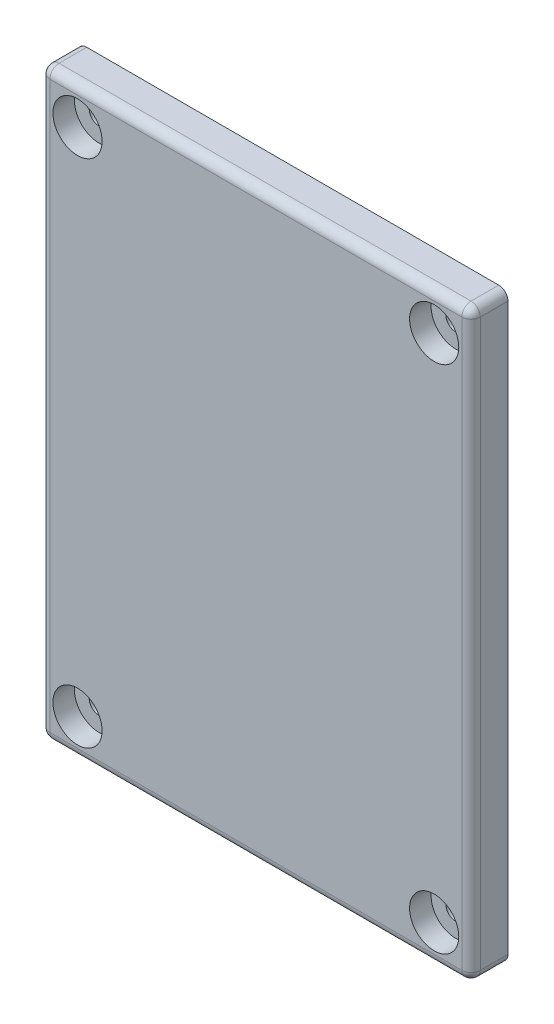
ISO-10303-21;
HEADER;
FILE_DESCRIPTION(('STEP AP214'),'2;1');
FILE_NAME('part.step','',(''),(''),'','','');
FILE_SCHEMA(('AUTOMOTIVE_DESIGN { 1 0 10303 214 1 1 1 1 }'));
ENDSEC;
DATA;
#1=APPLICATION_CONTEXT('core data for automotive mechanical design processes');
#2=APPLICATION_PROTOCOL_DEFINITION('international standard','automotive_design',2000,#1);
#3=PRODUCT_CONTEXT('',#1,'mechanical');
#4=PRODUCT('Part','Part','',(#3));
#5=PRODUCT_RELATED_PRODUCT_CATEGORY('part','',(#4));
#6=PRODUCT_DEFINITION_FORMATION('','',#4);
#7=PRODUCT_DEFINITION_CONTEXT('part definition',#1,'design');
#8=PRODUCT_DEFINITION('design','',#6,#7);
#9=PRODUCT_DEFINITION_SHAPE('','',#8);
#10=(LENGTH_UNIT() NAMED_UNIT(*) SI_UNIT(.MILLI.,.METRE.));
#11=(NAMED_UNIT(*) PLANE_ANGLE_UNIT() SI_UNIT($,.RADIAN.));
#12=(NAMED_UNIT(*) SI_UNIT($,.STERADIAN.) SOLID_ANGLE_UNIT());
#13=UNCERTAINTY_MEASURE_WITH_UNIT(LENGTH_MEASURE(1.E-05),#10,'distance_accuracy_value','');
#14=(GEOMETRIC_REPRESENTATION_CONTEXT(3) GLOBAL_UNCERTAINTY_ASSIGNED_CONTEXT((#13)) GLOBAL_UNIT_ASSIGNED_CONTEXT((#10,
#11,#12)) REPRESENTATION_CONTEXT('',''));
#15=CARTESIAN_POINT('',(0.,0.,0.));
#16=DIRECTION('',(0.,0.,1.));
#17=DIRECTION('',(1.,0.,0.));
#18=AXIS2_PLACEMENT_3D('',#15,#16,#17);
#19=CARTESIAN_POINT('',(-33.1019522776573,42.9718004338395,6.));
#20=DIRECTION('',(1.,0.,0.));
#21=DIRECTION('',(0.,1.,0.));
#22=AXIS2_PLACEMENT_3D('',#19,#20,#21);
#23=PLANE('',#22);
#24=DIRECTION('',(0.,-1.,0.));
#25=VECTOR('',#24,1.);
#26=CARTESIAN_POINT('',(-33.1019522776573,42.9718004338395,4.5));
#27=LINE('',#26,#25);
#28=CARTESIAN_POINT('',(-33.1019522776573,-50.5281995661605,4.5));
#29=VERTEX_POINT('',#28);
#30=CARTESIAN_POINT('',(-33.1019522776573,41.4718004338395,4.5));
#31=VERTEX_POINT('',#30);
#32=EDGE_CURVE('E279',#29,#31,#27,.F.);
#33=ORIENTED_EDGE('',*,*,#32,.T.);
#34=DIRECTION('',(0.,0.,-1.));
#35=VECTOR('',#34,1.);
#36=CARTESIAN_POINT('',(-33.1019522776573,41.4718004338395,6.));
#37=LINE('',#36,#35);
#38=CARTESIAN_POINT('',(-33.1019522776573,41.4718004338395,0.));
#39=VERTEX_POINT('',#38);
#40=EDGE_CURVE('E293',#31,#39,#37,.T.);
#41=ORIENTED_EDGE('',*,*,#40,.T.);
#42=DIRECTION('',(0.,-1.,0.));
#43=VECTOR('',#42,1.);
#44=CARTESIAN_POINT('',(-33.1019522776573,42.9718004338395,0.));
#45=LINE('',#44,#43);
#46=CARTESIAN_POINT('',(-33.1019522776573,-50.5281995661605,0.));
#47=VERTEX_POINT('',#46);
#48=EDGE_CURVE('E266',#39,#47,#45,.T.);
#49=ORIENTED_EDGE('',*,*,#48,.T.);
#50=DIRECTION('',(0.,0.,-1.));
#51=VECTOR('',#50,1.);
#52=CARTESIAN_POINT('',(-33.1019522776573,-50.5281995661605,6.));
#53=LINE('',#52,#51);
#54=EDGE_CURVE('E291',#47,#29,#53,.F.);
#55=ORIENTED_EDGE('',*,*,#54,.T.);
#56=EDGE_LOOP('',(#33,#41,#49,#55));
#57=FACE_BOUND('',#56,.T.);
#58=ADVANCED_FACE('F35',(#57),#23,.F.);
#59=CARTESIAN_POINT('',(-33.1019522776573,-52.0281995661605,6.));
#60=DIRECTION('',(0.,1.,0.));
#61=DIRECTION('',(0.,0.,1.));
#62=AXIS2_PLACEMENT_3D('',#59,#60,#61);
#63=PLANE('',#62);
#64=DIRECTION('',(1.,0.,0.));
#65=VECTOR('',#64,1.);
#66=CARTESIAN_POINT('',(-33.1019522776573,-52.0281995661605,4.5));
#67=LINE('',#66,#65);
#68=CARTESIAN_POINT('',(35.3980477223427,-52.0281995661605,4.5));
#69=VERTEX_POINT('',#68);
#70=CARTESIAN_POINT('',(-31.6019522776573,-52.0281995661605,4.5));
#71=VERTEX_POINT('',#70);
#72=EDGE_CURVE('E312',#69,#71,#67,.F.);
#73=ORIENTED_EDGE('',*,*,#72,.T.);
#74=DIRECTION('',(0.,0.,-1.));
#75=VECTOR('',#74,1.);
#76=CARTESIAN_POINT('',(-31.6019522776573,-52.0281995661605,6.));
#77=LINE('',#76,#75);
#78=CARTESIAN_POINT('',(-31.6019522776573,-52.0281995661605,0.));
#79=VERTEX_POINT('',#78);
#80=EDGE_CURVE('E314',#71,#79,#77,.T.);
#81=ORIENTED_EDGE('',*,*,#80,.T.);
#82=DIRECTION('',(1.,0.,0.));
#83=VECTOR('',#82,1.);
#84=CARTESIAN_POINT('',(-33.1019522776573,-52.0281995661605,0.));
#85=LINE('',#84,#83);
#86=CARTESIAN_POINT('',(35.3980477223427,-52.0281995661605,0.));
#87=VERTEX_POINT('',#86);
#88=EDGE_CURVE('E271',#79,#87,#85,.T.);
#89=ORIENTED_EDGE('',*,*,#88,.T.);
#90=DIRECTION('',(0.,0.,-1.));
#91=VECTOR('',#90,1.);
#92=CARTESIAN_POINT('',(35.3980477223427,-52.0281995661605,6.));
#93=LINE('',#92,#91);
#94=EDGE_CURVE('E310',#87,#69,#93,.F.);
#95=ORIENTED_EDGE('',*,*,#94,.T.);
#96=EDGE_LOOP('',(#73,#81,#89,#95));
#97=FACE_BOUND('',#96,.T.);
#98=ADVANCED_FACE('F397',(#97),#63,.F.);
#99=CARTESIAN_POINT('',(36.8980477223427,42.9718004338395,6.));
#100=DIRECTION('',(-1.,0.,0.));
#101=DIRECTION('',(0.,-1.,0.));
#102=AXIS2_PLACEMENT_3D('',#99,#100,#101);
#103=PLANE('',#102);
#104=DIRECTION('',(0.,1.,0.));
#105=VECTOR('',#104,1.);
#106=CARTESIAN_POINT('',(36.8980477223427,-52.0281995661605,4.5));
#107=LINE('',#106,#105);
#108=CARTESIAN_POINT('',(36.8980477223427,41.4718004338395,4.5));
#109=VERTEX_POINT('',#108);
#110=CARTESIAN_POINT('',(36.8980477223427,-50.5281995661605,4.5));
#111=VERTEX_POINT('',#110);
#112=EDGE_CURVE('E44',#109,#111,#107,.F.);
#113=ORIENTED_EDGE('',*,*,#112,.T.);
#114=DIRECTION('',(0.,0.,-1.));
#115=VECTOR('',#114,1.);
#116=CARTESIAN_POINT('',(36.8980477223427,-50.5281995661605,6.));
#117=LINE('',#116,#115);
#118=CARTESIAN_POINT('',(36.8980477223427,-50.5281995661605,0.));
#119=VERTEX_POINT('',#118);
#120=EDGE_CURVE('E11',#111,#119,#117,.T.);
#121=ORIENTED_EDGE('',*,*,#120,.T.);
#122=DIRECTION('',(0.,1.,0.));
#123=VECTOR('',#122,1.);
#124=CARTESIAN_POINT('',(36.8980477223427,42.9718004338395,0.));
#125=LINE('',#124,#123);
#126=CARTESIAN_POINT('',(36.8980477223427,41.4718004338395,0.));
#127=VERTEX_POINT('',#126);
#128=EDGE_CURVE('E274',#119,#127,#125,.T.);
#129=ORIENTED_EDGE('',*,*,#128,.T.);
#130=DIRECTION('',(0.,0.,-1.));
#131=VECTOR('',#130,1.);
#132=CARTESIAN_POINT('',(36.8980477223427,41.4718004338395,6.));
#133=LINE('',#132,#131);
#134=EDGE_CURVE('E55',#127,#109,#133,.F.);
#135=ORIENTED_EDGE('',*,*,#134,.T.);
#136=EDGE_LOOP('',(#113,#121,#129,#135));
#137=FACE_BOUND('',#136,.T.);
#138=ADVANCED_FACE('F370',(#137),#103,.F.);
#139=CARTESIAN_POINT('',(-33.1019522776573,42.9718004338395,6.));
#140=DIRECTION('',(0.,-1.,0.));
#141=DIRECTION('',(0.,0.,-1.));
#142=AXIS2_PLACEMENT_3D('',#139,#140,#141);
#143=PLANE('',#142);
#144=DIRECTION('',(-1.,0.,0.));
#145=VECTOR('',#144,1.);
#146=CARTESIAN_POINT('',(-33.1019522776573,42.9718004338395,0.));
#147=LINE('',#146,#145);
#148=CARTESIAN_POINT('',(35.3980477223427,42.9718004338395,0.));
#149=VERTEX_POINT('',#148);
#150=CARTESIAN_POINT('',(-31.6019522776573,42.9718004338395,0.));
#151=VERTEX_POINT('',#150);
#152=EDGE_CURVE('E276',#149,#151,#147,.T.);
#153=ORIENTED_EDGE('',*,*,#152,.T.);
#154=DIRECTION('',(0.,0.,-1.));
#155=VECTOR('',#154,1.);
#156=CARTESIAN_POINT('',(-31.6019522776573,42.9718004338395,6.));
#157=LINE('',#156,#155);
#158=CARTESIAN_POINT('',(-31.6019522776573,42.9718004338395,4.5));
#159=VERTEX_POINT('',#158);
#160=EDGE_CURVE('E308',#151,#159,#157,.F.);
#161=ORIENTED_EDGE('',*,*,#160,.T.);
#162=DIRECTION('',(-1.,0.,0.));
#163=VECTOR('',#162,1.);
#164=CARTESIAN_POINT('',(36.8980477223427,42.9718004338395,4.5));
#165=LINE('',#164,#163);
#166=CARTESIAN_POINT('',(35.3980477223427,42.9718004338395,4.5));
#167=VERTEX_POINT('',#166);
#168=EDGE_CURVE('E304',#159,#167,#165,.F.);
#169=ORIENTED_EDGE('',*,*,#168,.T.);
#170=DIRECTION('',(0.,0.,-1.));
#171=VECTOR('',#170,1.);
#172=CARTESIAN_POINT('',(35.3980477223427,42.9718004338395,6.));
#173=LINE('',#172,#171);
#174=EDGE_CURVE('E306',#167,#149,#173,.T.);
#175=ORIENTED_EDGE('',*,*,#174,.T.);
#176=EDGE_LOOP('',(#153,#161,#169,#175));
#177=FACE_BOUND('',#176,.T.);
#178=ADVANCED_FACE('F413',(#177),#143,.F.);
#179=CARTESIAN_POINT('',(0.,0.,6.));
#180=DIRECTION('',(0.,0.,1.));
#181=DIRECTION('',(1.,0.,0.));
#182=AXIS2_PLACEMENT_3D('',#179,#180,#181);
#183=PLANE('',#182);
#184=DIRECTION('',(-1.,0.,0.));
#185=VECTOR('',#184,1.);
#186=CARTESIAN_POINT('',(-33.1019522776573,41.4718004338395,6.));
#187=LINE('',#186,#185);
#188=CARTESIAN_POINT('',(35.3980477223427,41.4718004338395,6.));
#189=VERTEX_POINT('',#188);
#190=CARTESIAN_POINT('',(-31.6019522776573,41.4718004338395,6.));
#191=VERTEX_POINT('',#190);
#192=EDGE_CURVE('E316',#189,#191,#187,.T.);
#193=ORIENTED_EDGE('',*,*,#192,.T.);
#194=DIRECTION('',(0.,-1.,0.));
#195=VECTOR('',#194,1.);
#196=CARTESIAN_POINT('',(-31.6019522776573,-52.0281995661605,6.));
#197=LINE('',#196,#195);
#198=CARTESIAN_POINT('',(-31.6019522776573,-50.5281995661605,6.));
#199=VERTEX_POINT('',#198);
#200=EDGE_CURVE('E322',#191,#199,#197,.T.);
#201=ORIENTED_EDGE('',*,*,#200,.T.);
#202=DIRECTION('',(1.,0.,0.));
#203=VECTOR('',#202,1.);
#204=CARTESIAN_POINT('',(36.8980477223427,-50.5281995661605,6.));
#205=LINE('',#204,#203);
#206=CARTESIAN_POINT('',(35.3980477223427,-50.5281995661605,6.));
#207=VERTEX_POINT('',#206);
#208=EDGE_CURVE('E320',#199,#207,#205,.T.);
#209=ORIENTED_EDGE('',*,*,#208,.T.);
#210=DIRECTION('',(0.,1.,0.));
#211=VECTOR('',#210,1.);
#212=CARTESIAN_POINT('',(35.3980477223427,42.9718004338395,6.));
#213=LINE('',#212,#211);
#214=EDGE_CURVE('E318',#207,#189,#213,.T.);
#215=ORIENTED_EDGE('',*,*,#214,.T.);
#216=EDGE_LOOP('',(#193,#201,#209,#215));
#217=FACE_BOUND('',#216,.T.);
#218=CARTESIAN_POINT('',(-27.1019522776573,36.9718004338395,6.));
#219=DIRECTION('',(0.,0.,1.));
#220=DIRECTION('',(1.,0.,0.));
#221=AXIS2_PLACEMENT_3D('',#218,#219,#220);
#222=CIRCLE('',#221,4.);
#223=CARTESIAN_POINT('',(-23.1019522776573,36.9718004338395,6.));
#224=VERTEX_POINT('',#223);
#225=EDGE_CURVE('E255',#224,#224,#222,.T.);
#226=ORIENTED_EDGE('',*,*,#225,.F.);
#227=EDGE_LOOP('',(#226));
#228=FACE_BOUND('',#227,.T.);
#229=CARTESIAN_POINT('',(30.8980477223427,-46.0281995661605,6.));
#230=DIRECTION('',(0.,0.,1.));
#231=DIRECTION('',(1.,0.,0.));
#232=AXIS2_PLACEMENT_3D('',#229,#230,#231);
#233=CIRCLE('',#232,4.);
#234=CARTESIAN_POINT('',(34.8980477223427,-46.0281995661605,6.));
#235=VERTEX_POINT('',#234);
#236=EDGE_CURVE('E246',#235,#235,#233,.T.);
#237=ORIENTED_EDGE('',*,*,#236,.F.);
#238=EDGE_LOOP('',(#237));
#239=FACE_BOUND('',#238,.T.);
#240=CARTESIAN_POINT('',(-27.1019522776573,-46.0281995661605,6.));
#241=DIRECTION('',(0.,0.,1.));
#242=DIRECTION('',(1.,0.,0.));
#243=AXIS2_PLACEMENT_3D('',#240,#241,#242);
#244=CIRCLE('',#243,4.);
#245=CARTESIAN_POINT('',(-23.1019522776573,-46.0281995661605,6.));
#246=VERTEX_POINT('',#245);
#247=EDGE_CURVE('E247',#246,#246,#244,.T.);
#248=ORIENTED_EDGE('',*,*,#247,.F.);
#249=EDGE_LOOP('',(#248));
#250=FACE_BOUND('',#249,.T.);
#251=CARTESIAN_POINT('',(30.8980477223427,36.9718004338395,6.));
#252=DIRECTION('',(0.,0.,1.));
#253=DIRECTION('',(1.,0.,0.));
#254=AXIS2_PLACEMENT_3D('',#251,#252,#253);
#255=CIRCLE('',#254,4.);
#256=CARTESIAN_POINT('',(34.8980477223427,36.9718004338395,6.));
#257=VERTEX_POINT('',#256);
#258=EDGE_CURVE('E254',#257,#257,#255,.T.);
#259=ORIENTED_EDGE('',*,*,#258,.F.);
#260=EDGE_LOOP('',(#259));
#261=FACE_BOUND('',#260,.T.);
#262=ADVANCED_FACE('F388',(#217,#228,#239,#250,#261),#183,.T.);
#263=CARTESIAN_POINT('',(0.,0.,0.));
#264=DIRECTION('',(0.,0.,1.));
#265=DIRECTION('',(1.,0.,0.));
#266=AXIS2_PLACEMENT_3D('',#263,#264,#265);
#267=PLANE('',#266);
#268=DIRECTION('',(-1.,0.,0.));
#269=VECTOR('',#268,1.);
#270=CARTESIAN_POINT('',(-33.1019522776573,39.9718004338395,0.));
#271=LINE('',#270,#269);
#272=CARTESIAN_POINT('',(24.573492402006,39.9718004338395,0.));
#273=VERTEX_POINT('',#272);
#274=CARTESIAN_POINT('',(-20.7773969573205,39.9718004338395,0.));
#275=VERTEX_POINT('',#274);
#276=EDGE_CURVE('E202',#273,#275,#271,.T.);
#277=ORIENTED_EDGE('',*,*,#276,.T.);
#278=CARTESIAN_POINT('',(-27.1019522776573,36.9718004338395,0.));
#279=DIRECTION('',(0.,0.,1.));
#280=DIRECTION('',(1.,0.,0.));
#281=AXIS2_PLACEMENT_3D('',#278,#279,#280);
#282=CIRCLE('',#281,7.);
#283=CARTESIAN_POINT('',(-30.1019522776573,30.6472451135027,0.));
#284=VERTEX_POINT('',#283);
#285=EDGE_CURVE('E165',#275,#284,#282,.F.);
#286=ORIENTED_EDGE('',*,*,#285,.T.);
#287=DIRECTION('',(0.,-1.,0.));
#288=VECTOR('',#287,1.);
#289=CARTESIAN_POINT('',(-30.1019522776573,42.9718004338395,0.));
#290=LINE('',#289,#288);
#291=CARTESIAN_POINT('',(-30.1019522776573,-39.7036442458238,0.));
#292=VERTEX_POINT('',#291);
#293=EDGE_CURVE('E191',#284,#292,#290,.T.);
#294=ORIENTED_EDGE('',*,*,#293,.T.);
#295=CARTESIAN_POINT('',(-27.1019522776573,-46.0281995661605,0.));
#296=DIRECTION('',(0.,0.,1.));
#297=DIRECTION('',(1.,0.,0.));
#298=AXIS2_PLACEMENT_3D('',#295,#296,#297);
#299=CIRCLE('',#298,7.);
#300=CARTESIAN_POINT('',(-20.7773969573205,-49.0281995661605,0.));
#301=VERTEX_POINT('',#300);
#302=EDGE_CURVE('E223',#292,#301,#299,.F.);
#303=ORIENTED_EDGE('',*,*,#302,.T.);
#304=DIRECTION('',(1.,0.,0.));
#305=VECTOR('',#304,1.);
#306=CARTESIAN_POINT('',(-33.1019522776573,-49.0281995661605,0.));
#307=LINE('',#306,#305);
#308=CARTESIAN_POINT('',(24.573492402006,-49.0281995661605,0.));
#309=VERTEX_POINT('',#308);
#310=EDGE_CURVE('E201',#301,#309,#307,.T.);
#311=ORIENTED_EDGE('',*,*,#310,.T.);
#312=CARTESIAN_POINT('',(30.8980477223427,-46.0281995661605,0.));
#313=DIRECTION('',(0.,0.,1.));
#314=DIRECTION('',(1.,0.,0.));
#315=AXIS2_PLACEMENT_3D('',#312,#313,#314);
#316=CIRCLE('',#315,7.);
#317=CARTESIAN_POINT('',(33.8980477223427,-39.7036442458238,0.));
#318=VERTEX_POINT('',#317);
#319=EDGE_CURVE('E226',#309,#318,#316,.F.);
#320=ORIENTED_EDGE('',*,*,#319,.T.);
#321=DIRECTION('',(0.,1.,0.));
#322=VECTOR('',#321,1.);
#323=CARTESIAN_POINT('',(33.8980477223427,42.9718004338395,0.));
#324=LINE('',#323,#322);
#325=CARTESIAN_POINT('',(33.8980477223427,30.6472451135027,0.));
#326=VERTEX_POINT('',#325);
#327=EDGE_CURVE('E204',#318,#326,#324,.T.);
#328=ORIENTED_EDGE('',*,*,#327,.T.);
#329=CARTESIAN_POINT('',(30.8980477223427,36.9718004338395,0.));
#330=DIRECTION('',(0.,0.,1.));
#331=DIRECTION('',(1.,0.,0.));
#332=AXIS2_PLACEMENT_3D('',#329,#330,#331);
#333=CIRCLE('',#332,7.);
#334=EDGE_CURVE('E169',#326,#273,#333,.F.);
#335=ORIENTED_EDGE('',*,*,#334,.T.);
#336=EDGE_LOOP('',(#277,#286,#294,#303,#311,#320,#328,#335));
#337=FACE_BOUND('',#336,.T.);
#338=CARTESIAN_POINT('',(30.8980477223427,-46.0281995661605,0.));
#339=DIRECTION('',(0.,0.,1.));
#340=DIRECTION('',(1.,0.,0.));
#341=AXIS2_PLACEMENT_3D('',#338,#339,#340);
#342=CIRCLE('',#341,1.6);
#343=CARTESIAN_POINT('',(32.4980477223427,-46.0281995661605,0.));
#344=VERTEX_POINT('',#343);
#345=EDGE_CURVE('E230',#344,#344,#342,.T.);
#346=ORIENTED_EDGE('',*,*,#345,.T.);
#347=EDGE_LOOP('',(#346));
#348=FACE_BOUND('',#347,.T.);
#349=CARTESIAN_POINT('',(-27.1019522776573,-46.0281995661605,0.));
#350=DIRECTION('',(0.,0.,1.));
#351=DIRECTION('',(1.,0.,0.));
#352=AXIS2_PLACEMENT_3D('',#349,#350,#351);
#353=CIRCLE('',#352,1.6);
#354=CARTESIAN_POINT('',(-25.5019522776573,-46.0281995661605,0.));
#355=VERTEX_POINT('',#354);
#356=EDGE_CURVE('E235',#355,#355,#353,.T.);
#357=ORIENTED_EDGE('',*,*,#356,.T.);
#358=EDGE_LOOP('',(#357));
#359=FACE_BOUND('',#358,.T.);
#360=CARTESIAN_POINT('',(-27.1019522776573,36.9718004338395,0.));
#361=DIRECTION('',(0.,0.,1.));
#362=DIRECTION('',(1.,0.,0.));
#363=AXIS2_PLACEMENT_3D('',#360,#361,#362);
#364=CIRCLE('',#363,1.6);
#365=CARTESIAN_POINT('',(-25.5019522776573,36.9718004338395,0.));
#366=VERTEX_POINT('',#365);
#367=EDGE_CURVE('E231',#366,#366,#364,.T.);
#368=ORIENTED_EDGE('',*,*,#367,.T.);
#369=EDGE_LOOP('',(#368));
#370=FACE_BOUND('',#369,.T.);
#371=CARTESIAN_POINT('',(30.8980477223427,36.9718004338395,0.));
#372=DIRECTION('',(0.,0.,1.));
#373=DIRECTION('',(1.,0.,0.));
#374=AXIS2_PLACEMENT_3D('',#371,#372,#373);
#375=CIRCLE('',#374,1.6);
#376=CARTESIAN_POINT('',(32.4980477223427,36.9718004338395,0.));
#377=VERTEX_POINT('',#376);
#378=EDGE_CURVE('E234',#377,#377,#375,.T.);
#379=ORIENTED_EDGE('',*,*,#378,.T.);
#380=EDGE_LOOP('',(#379));
#381=FACE_BOUND('',#380,.T.);
#382=ORIENTED_EDGE('',*,*,#48,.F.);
#383=CARTESIAN_POINT('',(-31.6019522776573,41.4718004338395,0.));
#384=DIRECTION('',(0.,0.,1.));
#385=DIRECTION('',(1.,0.,0.));
#386=AXIS2_PLACEMENT_3D('',#383,#384,#385);
#387=CIRCLE('',#386,1.5);
#388=EDGE_CURVE('E302',#39,#151,#387,.F.);
#389=ORIENTED_EDGE('',*,*,#388,.T.);
#390=ORIENTED_EDGE('',*,*,#152,.F.);
#391=CARTESIAN_POINT('',(35.3980477223427,41.4718004338395,0.));
#392=DIRECTION('',(0.,0.,1.));
#393=DIRECTION('',(1.,0.,0.));
#394=AXIS2_PLACEMENT_3D('',#391,#392,#393);
#395=CIRCLE('',#394,1.5);
#396=EDGE_CURVE('E296',#149,#127,#395,.F.);
#397=ORIENTED_EDGE('',*,*,#396,.T.);
#398=ORIENTED_EDGE('',*,*,#128,.F.);
#399=CARTESIAN_POINT('',(35.3980477223427,-50.5281995661605,0.));
#400=DIRECTION('',(0.,0.,1.));
#401=DIRECTION('',(1.,0.,0.));
#402=AXIS2_PLACEMENT_3D('',#399,#400,#401);
#403=CIRCLE('',#402,1.5);
#404=EDGE_CURVE('E298',#119,#87,#403,.F.);
#405=ORIENTED_EDGE('',*,*,#404,.T.);
#406=ORIENTED_EDGE('',*,*,#88,.F.);
#407=CARTESIAN_POINT('',(-31.6019522776573,-50.5281995661605,0.));
#408=DIRECTION('',(0.,0.,1.));
#409=DIRECTION('',(1.,0.,0.));
#410=AXIS2_PLACEMENT_3D('',#407,#408,#409);
#411=CIRCLE('',#410,1.5);
#412=EDGE_CURVE('E300',#79,#47,#411,.F.);
#413=ORIENTED_EDGE('',*,*,#412,.T.);
#414=EDGE_LOOP('',(#382,#389,#390,#397,#398,#405,#406,#413));
#415=FACE_BOUND('',#414,.T.);
#416=ADVANCED_FACE('F373',(#337,#348,#359,#370,#381,#415),#267,.F.);
#417=CARTESIAN_POINT('',(30.8980477223427,36.9718004338395,2.5));
#418=DIRECTION('',(0.,0.,1.));
#419=DIRECTION('',(1.,0.,0.));
#420=AXIS2_PLACEMENT_3D('',#417,#418,#419);
#421=CYLINDRICAL_SURFACE('',#420,4.);
#422=CARTESIAN_POINT('',(30.8980477223427,36.9718004338395,2.5));
#423=DIRECTION('',(0.,0.,1.));
#424=DIRECTION('',(1.,0.,0.));
#425=AXIS2_PLACEMENT_3D('',#422,#423,#424);
#426=CIRCLE('',#425,4.);
#427=CARTESIAN_POINT('',(34.8980477223427,36.9718004338395,2.5));
#428=VERTEX_POINT('',#427);
#429=EDGE_CURVE('E263',#428,#428,#426,.T.);
#430=ORIENTED_EDGE('',*,*,#429,.F.);
#431=EDGE_LOOP('',(#430));
#432=FACE_BOUND('',#431,.T.);
#433=ORIENTED_EDGE('',*,*,#258,.T.);
#434=EDGE_LOOP('',(#433));
#435=FACE_BOUND('',#434,.T.);
#436=ADVANCED_FACE('F692',(#432,#435),#421,.F.);
#437=CARTESIAN_POINT('',(30.8980477223427,36.9718004338395,2.5));
#438=DIRECTION('',(0.,0.,1.));
#439=DIRECTION('',(1.,0.,0.));
#440=AXIS2_PLACEMENT_3D('',#437,#438,#439);
#441=PLANE('',#440);
#442=CARTESIAN_POINT('',(30.8980477223427,36.9718004338395,2.5));
#443=DIRECTION('',(0.,0.,1.));
#444=DIRECTION('',(1.,0.,0.));
#445=AXIS2_PLACEMENT_3D('',#442,#443,#444);
#446=CIRCLE('',#445,1.6);
#447=CARTESIAN_POINT('',(32.4980477223427,36.9718004338395,2.5));
#448=VERTEX_POINT('',#447);
#449=EDGE_CURVE('E250',#448,#448,#446,.T.);
#450=ORIENTED_EDGE('',*,*,#449,.F.);
#451=EDGE_LOOP('',(#450));
#452=FACE_BOUND('',#451,.T.);
#453=ORIENTED_EDGE('',*,*,#429,.T.);
#454=EDGE_LOOP('',(#453));
#455=FACE_BOUND('',#454,.T.);
#456=ADVANCED_FACE('F683',(#452,#455),#441,.T.);
#457=CARTESIAN_POINT('',(-27.1019522776573,-46.0281995661605,2.5));
#458=DIRECTION('',(0.,0.,1.));
#459=DIRECTION('',(1.,0.,0.));
#460=AXIS2_PLACEMENT_3D('',#457,#458,#459);
#461=CYLINDRICAL_SURFACE('',#460,4.);
#462=CARTESIAN_POINT('',(-27.1019522776573,-46.0281995661605,2.5));
#463=DIRECTION('',(0.,0.,1.));
#464=DIRECTION('',(1.,0.,0.));
#465=AXIS2_PLACEMENT_3D('',#462,#463,#464);
#466=CIRCLE('',#465,4.);
#467=CARTESIAN_POINT('',(-23.1019522776573,-46.0281995661605,2.5));
#468=VERTEX_POINT('',#467);
#469=EDGE_CURVE('E243',#468,#468,#466,.T.);
#470=ORIENTED_EDGE('',*,*,#469,.F.);
#471=EDGE_LOOP('',(#470));
#472=FACE_BOUND('',#471,.T.);
#473=ORIENTED_EDGE('',*,*,#247,.T.);
#474=EDGE_LOOP('',(#473));
#475=FACE_BOUND('',#474,.T.);
#476=ADVANCED_FACE('F675',(#472,#475),#461,.F.);
#477=CARTESIAN_POINT('',(-27.1019522776573,-46.0281995661605,2.5));
#478=DIRECTION('',(0.,0.,1.));
#479=DIRECTION('',(1.,0.,0.));
#480=AXIS2_PLACEMENT_3D('',#477,#478,#479);
#481=PLANE('',#480);
#482=CARTESIAN_POINT('',(-27.1019522776573,-46.0281995661605,2.5));
#483=DIRECTION('',(0.,0.,1.));
#484=DIRECTION('',(1.,0.,0.));
#485=AXIS2_PLACEMENT_3D('',#482,#483,#484);
#486=CIRCLE('',#485,1.6);
#487=CARTESIAN_POINT('',(-25.5019522776573,-46.0281995661605,2.5));
#488=VERTEX_POINT('',#487);
#489=EDGE_CURVE('E285',#488,#488,#486,.T.);
#490=ORIENTED_EDGE('',*,*,#489,.F.);
#491=EDGE_LOOP('',(#490));
#492=FACE_BOUND('',#491,.T.);
#493=ORIENTED_EDGE('',*,*,#469,.T.);
#494=EDGE_LOOP('',(#493));
#495=FACE_BOUND('',#494,.T.);
#496=ADVANCED_FACE('F666',(#492,#495),#481,.T.);
#497=CARTESIAN_POINT('',(30.8980477223427,-46.0281995661605,2.5));
#498=DIRECTION('',(0.,0.,1.));
#499=DIRECTION('',(1.,0.,0.));
#500=AXIS2_PLACEMENT_3D('',#497,#498,#499);
#501=CYLINDRICAL_SURFACE('',#500,4.);
#502=CARTESIAN_POINT('',(30.8980477223427,-46.0281995661605,2.5));
#503=DIRECTION('',(0.,0.,1.));
#504=DIRECTION('',(1.,0.,0.));
#505=AXIS2_PLACEMENT_3D('',#502,#503,#504);
#506=CIRCLE('',#505,4.);
#507=CARTESIAN_POINT('',(34.8980477223427,-46.0281995661605,2.5));
#508=VERTEX_POINT('',#507);
#509=EDGE_CURVE('E258',#508,#508,#506,.T.);
#510=ORIENTED_EDGE('',*,*,#509,.F.);
#511=EDGE_LOOP('',(#510));
#512=FACE_BOUND('',#511,.T.);
#513=ORIENTED_EDGE('',*,*,#236,.T.);
#514=EDGE_LOOP('',(#513));
#515=FACE_BOUND('',#514,.T.);
#516=ADVANCED_FACE('F657',(#512,#515),#501,.F.);
#517=CARTESIAN_POINT('',(30.8980477223427,-46.0281995661605,2.5));
#518=DIRECTION('',(0.,0.,1.));
#519=DIRECTION('',(1.,0.,0.));
#520=AXIS2_PLACEMENT_3D('',#517,#518,#519);
#521=PLANE('',#520);
#522=CARTESIAN_POINT('',(30.8980477223427,-46.0281995661605,2.5));
#523=DIRECTION('',(0.,0.,1.));
#524=DIRECTION('',(1.,0.,0.));
#525=AXIS2_PLACEMENT_3D('',#522,#523,#524);
#526=CIRCLE('',#525,1.6);
#527=CARTESIAN_POINT('',(32.4980477223427,-46.0281995661605,2.5));
#528=VERTEX_POINT('',#527);
#529=EDGE_CURVE('E282',#528,#528,#526,.T.);
#530=ORIENTED_EDGE('',*,*,#529,.F.);
#531=EDGE_LOOP('',(#530));
#532=FACE_BOUND('',#531,.T.);
#533=ORIENTED_EDGE('',*,*,#509,.T.);
#534=EDGE_LOOP('',(#533));
#535=FACE_BOUND('',#534,.T.);
#536=ADVANCED_FACE('F647',(#532,#535),#521,.T.);
#537=CARTESIAN_POINT('',(-27.1019522776573,36.9718004338395,2.5));
#538=DIRECTION('',(0.,0.,1.));
#539=DIRECTION('',(1.,0.,0.));
#540=AXIS2_PLACEMENT_3D('',#537,#538,#539);
#541=CYLINDRICAL_SURFACE('',#540,4.);
#542=CARTESIAN_POINT('',(-27.1019522776573,36.9718004338395,2.5));
#543=DIRECTION('',(0.,0.,1.));
#544=DIRECTION('',(1.,0.,0.));
#545=AXIS2_PLACEMENT_3D('',#542,#543,#544);
#546=CIRCLE('',#545,4.);
#547=CARTESIAN_POINT('',(-23.1019522776573,36.9718004338395,2.5));
#548=VERTEX_POINT('',#547);
#549=EDGE_CURVE('E251',#548,#548,#546,.T.);
#550=ORIENTED_EDGE('',*,*,#549,.F.);
#551=EDGE_LOOP('',(#550));
#552=FACE_BOUND('',#551,.T.);
#553=ORIENTED_EDGE('',*,*,#225,.T.);
#554=EDGE_LOOP('',(#553));
#555=FACE_BOUND('',#554,.T.);
#556=ADVANCED_FACE('F637',(#552,#555),#541,.F.);
#557=CARTESIAN_POINT('',(-27.1019522776573,36.9718004338395,2.5));
#558=DIRECTION('',(0.,0.,1.));
#559=DIRECTION('',(1.,0.,0.));
#560=AXIS2_PLACEMENT_3D('',#557,#558,#559);
#561=PLANE('',#560);
#562=CARTESIAN_POINT('',(-27.1019522776573,36.9718004338395,2.5));
#563=DIRECTION('',(0.,0.,1.));
#564=DIRECTION('',(1.,0.,0.));
#565=AXIS2_PLACEMENT_3D('',#562,#563,#564);
#566=CIRCLE('',#565,1.6);
#567=CARTESIAN_POINT('',(-25.5019522776573,36.9718004338395,2.5));
#568=VERTEX_POINT('',#567);
#569=EDGE_CURVE('E242',#568,#568,#566,.T.);
#570=ORIENTED_EDGE('',*,*,#569,.F.);
#571=EDGE_LOOP('',(#570));
#572=FACE_BOUND('',#571,.T.);
#573=ORIENTED_EDGE('',*,*,#549,.T.);
#574=EDGE_LOOP('',(#573));
#575=FACE_BOUND('',#574,.T.);
#576=ADVANCED_FACE('F628',(#572,#575),#561,.T.);
#577=CARTESIAN_POINT('',(-27.1019522776573,36.9718004338395,0.));
#578=DIRECTION('',(0.,0.,1.));
#579=DIRECTION('',(1.,0.,0.));
#580=AXIS2_PLACEMENT_3D('',#577,#578,#579);
#581=CYLINDRICAL_SURFACE('',#580,1.6);
#582=ORIENTED_EDGE('',*,*,#569,.T.);
#583=EDGE_LOOP('',(#582));
#584=FACE_BOUND('',#583,.T.);
#585=ORIENTED_EDGE('',*,*,#367,.F.);
#586=EDGE_LOOP('',(#585));
#587=FACE_BOUND('',#586,.T.);
#588=ADVANCED_FACE('F619',(#584,#587),#581,.F.);
#589=CARTESIAN_POINT('',(30.8980477223427,-46.0281995661605,0.));
#590=DIRECTION('',(0.,0.,1.));
#591=DIRECTION('',(1.,0.,0.));
#592=AXIS2_PLACEMENT_3D('',#589,#590,#591);
#593=CYLINDRICAL_SURFACE('',#592,1.6);
#594=ORIENTED_EDGE('',*,*,#529,.T.);
#595=EDGE_LOOP('',(#594));
#596=FACE_BOUND('',#595,.T.);
#597=ORIENTED_EDGE('',*,*,#345,.F.);
#598=EDGE_LOOP('',(#597));
#599=FACE_BOUND('',#598,.T.);
#600=ADVANCED_FACE('F610',(#596,#599),#593,.F.);
#601=CARTESIAN_POINT('',(-27.1019522776573,-46.0281995661605,0.));
#602=DIRECTION('',(0.,0.,1.));
#603=DIRECTION('',(1.,0.,0.));
#604=AXIS2_PLACEMENT_3D('',#601,#602,#603);
#605=CYLINDRICAL_SURFACE('',#604,1.6);
#606=ORIENTED_EDGE('',*,*,#489,.T.);
#607=EDGE_LOOP('',(#606));
#608=FACE_BOUND('',#607,.T.);
#609=ORIENTED_EDGE('',*,*,#356,.F.);
#610=EDGE_LOOP('',(#609));
#611=FACE_BOUND('',#610,.T.);
#612=ADVANCED_FACE('F601',(#608,#611),#605,.F.);
#613=CARTESIAN_POINT('',(30.8980477223427,36.9718004338395,0.));
#614=DIRECTION('',(0.,0.,1.));
#615=DIRECTION('',(1.,0.,0.));
#616=AXIS2_PLACEMENT_3D('',#613,#614,#615);
#617=CYLINDRICAL_SURFACE('',#616,1.6);
#618=ORIENTED_EDGE('',*,*,#449,.T.);
#619=EDGE_LOOP('',(#618));
#620=FACE_BOUND('',#619,.T.);
#621=ORIENTED_EDGE('',*,*,#378,.F.);
#622=EDGE_LOOP('',(#621));
#623=FACE_BOUND('',#622,.T.);
#624=ADVANCED_FACE('F592',(#620,#623),#617,.F.);
#625=CARTESIAN_POINT('',(-30.1019522776573,42.9718004338395,6.));
#626=DIRECTION('',(1.,0.,0.));
#627=DIRECTION('',(0.,1.,0.));
#628=AXIS2_PLACEMENT_3D('',#625,#626,#627);
#629=PLANE('',#628);
#630=DIRECTION('',(0.,-1.,0.));
#631=VECTOR('',#630,1.);
#632=CARTESIAN_POINT('',(-30.1019522776573,42.9718004338395,3.));
#633=LINE('',#632,#631);
#634=CARTESIAN_POINT('',(-30.1019522776573,30.6472451135027,3.));
#635=VERTEX_POINT('',#634);
#636=CARTESIAN_POINT('',(-30.1019522776573,-39.7036442458238,3.));
#637=VERTEX_POINT('',#636);
#638=EDGE_CURVE('E187',#635,#637,#633,.T.);
#639=ORIENTED_EDGE('',*,*,#638,.T.);
#640=DIRECTION('',(0.,0.,1.));
#641=VECTOR('',#640,1.);
#642=CARTESIAN_POINT('',(-30.1019522776573,-39.7036442458238,2.5));
#643=LINE('',#642,#641);
#644=EDGE_CURVE('E213',#637,#292,#643,.F.);
#645=ORIENTED_EDGE('',*,*,#644,.T.);
#646=ORIENTED_EDGE('',*,*,#293,.F.);
#647=DIRECTION('',(0.,0.,1.));
#648=VECTOR('',#647,1.);
#649=CARTESIAN_POINT('',(-30.1019522776573,30.6472451135027,2.5));
#650=LINE('',#649,#648);
#651=EDGE_CURVE('E170',#635,#284,#650,.F.);
#652=ORIENTED_EDGE('',*,*,#651,.F.);
#653=EDGE_LOOP('',(#639,#645,#646,#652));
#654=FACE_BOUND('',#653,.T.);
#655=ADVANCED_FACE('F583',(#654),#629,.T.);
#656=CARTESIAN_POINT('',(-33.1019522776573,-49.0281995661605,6.));
#657=DIRECTION('',(0.,1.,0.));
#658=DIRECTION('',(0.,0.,1.));
#659=AXIS2_PLACEMENT_3D('',#656,#657,#658);
#660=PLANE('',#659);
#661=DIRECTION('',(0.,0.,1.));
#662=VECTOR('',#661,1.);
#663=CARTESIAN_POINT('',(24.573492402006,-49.0281995661605,2.5));
#664=LINE('',#663,#662);
#665=CARTESIAN_POINT('',(24.573492402006,-49.0281995661605,3.));
#666=VERTEX_POINT('',#665);
#667=EDGE_CURVE('E216',#666,#309,#664,.F.);
#668=ORIENTED_EDGE('',*,*,#667,.T.);
#669=ORIENTED_EDGE('',*,*,#310,.F.);
#670=DIRECTION('',(0.,0.,1.));
#671=VECTOR('',#670,1.);
#672=CARTESIAN_POINT('',(-20.7773969573205,-49.0281995661605,2.5));
#673=LINE('',#672,#671);
#674=CARTESIAN_POINT('',(-20.7773969573205,-49.0281995661605,3.));
#675=VERTEX_POINT('',#674);
#676=EDGE_CURVE('E211',#675,#301,#673,.F.);
#677=ORIENTED_EDGE('',*,*,#676,.F.);
#678=DIRECTION('',(1.,0.,0.));
#679=VECTOR('',#678,1.);
#680=CARTESIAN_POINT('',(-33.1019522776573,-49.0281995661605,3.));
#681=LINE('',#680,#679);
#682=EDGE_CURVE('E787',#675,#666,#681,.T.);
#683=ORIENTED_EDGE('',*,*,#682,.T.);
#684=EDGE_LOOP('',(#668,#669,#677,#683));
#685=FACE_BOUND('',#684,.T.);
#686=ADVANCED_FACE('F574',(#685),#660,.T.);
#687=CARTESIAN_POINT('',(33.8980477223427,42.9718004338395,6.));
#688=DIRECTION('',(-1.,0.,0.));
#689=DIRECTION('',(0.,-1.,0.));
#690=AXIS2_PLACEMENT_3D('',#687,#688,#689);
#691=PLANE('',#690);
#692=DIRECTION('',(0.,1.,0.));
#693=VECTOR('',#692,1.);
#694=CARTESIAN_POINT('',(33.8980477223427,42.9718004338395,3.));
#695=LINE('',#694,#693);
#696=CARTESIAN_POINT('',(33.8980477223427,-39.7036442458238,3.));
#697=VERTEX_POINT('',#696);
#698=CARTESIAN_POINT('',(33.8980477223427,30.6472451135027,3.));
#699=VERTEX_POINT('',#698);
#700=EDGE_CURVE('E180',#697,#699,#695,.T.);
#701=ORIENTED_EDGE('',*,*,#700,.T.);
#702=DIRECTION('',(0.,0.,1.));
#703=VECTOR('',#702,1.);
#704=CARTESIAN_POINT('',(33.8980477223427,30.6472451135027,2.5));
#705=LINE('',#704,#703);
#706=EDGE_CURVE('E179',#699,#326,#705,.F.);
#707=ORIENTED_EDGE('',*,*,#706,.T.);
#708=ORIENTED_EDGE('',*,*,#327,.F.);
#709=DIRECTION('',(0.,0.,1.));
#710=VECTOR('',#709,1.);
#711=CARTESIAN_POINT('',(33.8980477223427,-39.7036442458238,2.5));
#712=LINE('',#711,#710);
#713=EDGE_CURVE('E218',#697,#318,#712,.F.);
#714=ORIENTED_EDGE('',*,*,#713,.F.);
#715=EDGE_LOOP('',(#701,#707,#708,#714));
#716=FACE_BOUND('',#715,.T.);
#717=ADVANCED_FACE('F566',(#716),#691,.T.);
#718=CARTESIAN_POINT('',(-33.1019522776573,39.9718004338395,6.));
#719=DIRECTION('',(0.,-1.,0.));
#720=DIRECTION('',(0.,0.,-1.));
#721=AXIS2_PLACEMENT_3D('',#718,#719,#720);
#722=PLANE('',#721);
#723=DIRECTION('',(0.,0.,1.));
#724=VECTOR('',#723,1.);
#725=CARTESIAN_POINT('',(-20.7773969573205,39.9718004338395,2.5));
#726=LINE('',#725,#724);
#727=CARTESIAN_POINT('',(-20.7773969573205,39.9718004338395,3.));
#728=VERTEX_POINT('',#727);
#729=EDGE_CURVE('E159',#728,#275,#726,.F.);
#730=ORIENTED_EDGE('',*,*,#729,.T.);
#731=ORIENTED_EDGE('',*,*,#276,.F.);
#732=DIRECTION('',(0.,0.,1.));
#733=VECTOR('',#732,1.);
#734=CARTESIAN_POINT('',(24.573492402006,39.9718004338395,2.5));
#735=LINE('',#734,#733);
#736=CARTESIAN_POINT('',(24.573492402006,39.9718004338395,3.));
#737=VERTEX_POINT('',#736);
#738=EDGE_CURVE('E175',#737,#273,#735,.F.);
#739=ORIENTED_EDGE('',*,*,#738,.F.);
#740=DIRECTION('',(-1.,0.,0.));
#741=VECTOR('',#740,1.);
#742=CARTESIAN_POINT('',(-33.1019522776573,39.9718004338395,3.));
#743=LINE('',#742,#741);
#744=EDGE_CURVE('E173',#737,#728,#743,.T.);
#745=ORIENTED_EDGE('',*,*,#744,.T.);
#746=EDGE_LOOP('',(#730,#731,#739,#745));
#747=FACE_BOUND('',#746,.T.);
#748=ADVANCED_FACE('F174',(#747),#722,.T.);
#749=CARTESIAN_POINT('',(0.,0.,3.));
#750=DIRECTION('',(0.,0.,1.));
#751=DIRECTION('',(1.,0.,0.));
#752=AXIS2_PLACEMENT_3D('',#749,#750,#751);
#753=PLANE('',#752);
#754=ORIENTED_EDGE('',*,*,#700,.F.);
#755=CARTESIAN_POINT('',(30.8980477223427,-46.0281995661605,3.));
#756=DIRECTION('',(0.,0.,1.));
#757=DIRECTION('',(1.,0.,0.));
#758=AXIS2_PLACEMENT_3D('',#755,#756,#757);
#759=CIRCLE('',#758,7.);
#760=EDGE_CURVE('E189',#697,#666,#759,.T.);
#761=ORIENTED_EDGE('',*,*,#760,.T.);
#762=ORIENTED_EDGE('',*,*,#682,.F.);
#763=CARTESIAN_POINT('',(-27.1019522776573,-46.0281995661605,3.));
#764=DIRECTION('',(0.,0.,1.));
#765=DIRECTION('',(1.,0.,0.));
#766=AXIS2_PLACEMENT_3D('',#763,#764,#765);
#767=CIRCLE('',#766,7.);
#768=EDGE_CURVE('E194',#675,#637,#767,.T.);
#769=ORIENTED_EDGE('',*,*,#768,.T.);
#770=ORIENTED_EDGE('',*,*,#638,.F.);
#771=CARTESIAN_POINT('',(-27.1019522776573,36.9718004338395,3.));
#772=DIRECTION('',(0.,0.,1.));
#773=DIRECTION('',(1.,0.,0.));
#774=AXIS2_PLACEMENT_3D('',#771,#772,#773);
#775=CIRCLE('',#774,7.);
#776=EDGE_CURVE('E163',#635,#728,#775,.T.);
#777=ORIENTED_EDGE('',*,*,#776,.T.);
#778=ORIENTED_EDGE('',*,*,#744,.F.);
#779=CARTESIAN_POINT('',(30.8980477223427,36.9718004338395,3.));
#780=DIRECTION('',(0.,0.,1.));
#781=DIRECTION('',(1.,0.,0.));
#782=AXIS2_PLACEMENT_3D('',#779,#780,#781);
#783=CIRCLE('',#782,7.);
#784=EDGE_CURVE('E188',#737,#699,#783,.T.);
#785=ORIENTED_EDGE('',*,*,#784,.T.);
#786=EDGE_LOOP('',(#754,#761,#762,#769,#770,#777,#778,#785));
#787=FACE_BOUND('',#786,.T.);
#788=ADVANCED_FACE('F184',(#787),#753,.F.);
#789=CARTESIAN_POINT('',(30.8980477223427,36.9718004338395,2.5));
#790=DIRECTION('',(0.,0.,1.));
#791=DIRECTION('',(1.,0.,0.));
#792=AXIS2_PLACEMENT_3D('',#789,#790,#791);
#793=CYLINDRICAL_SURFACE('',#792,7.);
#794=ORIENTED_EDGE('',*,*,#706,.F.);
#795=ORIENTED_EDGE('',*,*,#784,.F.);
#796=ORIENTED_EDGE('',*,*,#738,.T.);
#797=ORIENTED_EDGE('',*,*,#334,.F.);
#798=EDGE_LOOP('',(#794,#795,#796,#797));
#799=FACE_BOUND('',#798,.T.);
#800=ADVANCED_FACE('F542',(#799),#793,.T.);
#801=CARTESIAN_POINT('',(-27.1019522776573,-46.0281995661605,2.5));
#802=DIRECTION('',(0.,0.,1.));
#803=DIRECTION('',(1.,0.,0.));
#804=AXIS2_PLACEMENT_3D('',#801,#802,#803);
#805=CYLINDRICAL_SURFACE('',#804,7.);
#806=ORIENTED_EDGE('',*,*,#644,.F.);
#807=ORIENTED_EDGE('',*,*,#768,.F.);
#808=ORIENTED_EDGE('',*,*,#676,.T.);
#809=ORIENTED_EDGE('',*,*,#302,.F.);
#810=EDGE_LOOP('',(#806,#807,#808,#809));
#811=FACE_BOUND('',#810,.T.);
#812=ADVANCED_FACE('F533',(#811),#805,.T.);
#813=CARTESIAN_POINT('',(30.8980477223427,-46.0281995661605,2.5));
#814=DIRECTION('',(0.,0.,1.));
#815=DIRECTION('',(1.,0.,0.));
#816=AXIS2_PLACEMENT_3D('',#813,#814,#815);
#817=CYLINDRICAL_SURFACE('',#816,7.);
#818=ORIENTED_EDGE('',*,*,#667,.F.);
#819=ORIENTED_EDGE('',*,*,#760,.F.);
#820=ORIENTED_EDGE('',*,*,#713,.T.);
#821=ORIENTED_EDGE('',*,*,#319,.F.);
#822=EDGE_LOOP('',(#818,#819,#820,#821));
#823=FACE_BOUND('',#822,.T.);
#824=ADVANCED_FACE('F525',(#823),#817,.T.);
#825=CARTESIAN_POINT('',(-27.1019522776573,36.9718004338395,2.5));
#826=DIRECTION('',(0.,0.,1.));
#827=DIRECTION('',(1.,0.,0.));
#828=AXIS2_PLACEMENT_3D('',#825,#826,#827);
#829=CYLINDRICAL_SURFACE('',#828,7.);
#830=ORIENTED_EDGE('',*,*,#729,.F.);
#831=ORIENTED_EDGE('',*,*,#776,.F.);
#832=ORIENTED_EDGE('',*,*,#651,.T.);
#833=ORIENTED_EDGE('',*,*,#285,.F.);
#834=EDGE_LOOP('',(#830,#831,#832,#833));
#835=FACE_BOUND('',#834,.T.);
#836=ADVANCED_FACE('F161',(#835),#829,.T.);
#837=CARTESIAN_POINT('',(35.3980477223427,-50.5281995661605,6.));
#838=DIRECTION('',(0.,0.,-1.));
#839=DIRECTION('',(-1.,0.,0.));
#840=AXIS2_PLACEMENT_3D('',#837,#838,#839);
#841=CYLINDRICAL_SURFACE('',#840,1.5);
#842=CARTESIAN_POINT('',(35.3980477223427,-50.5281995661605,4.5));
#843=DIRECTION('',(0.,0.,1.));
#844=DIRECTION('',(1.,0.,0.));
#845=AXIS2_PLACEMENT_3D('',#842,#843,#844);
#846=CIRCLE('',#845,1.5);
#847=EDGE_CURVE('E39',#69,#111,#846,.T.);
#848=ORIENTED_EDGE('',*,*,#847,.F.);
#849=ORIENTED_EDGE('',*,*,#94,.F.);
#850=ORIENTED_EDGE('',*,*,#404,.F.);
#851=ORIENTED_EDGE('',*,*,#120,.F.);
#852=EDGE_LOOP('',(#848,#849,#850,#851));
#853=FACE_BOUND('',#852,.T.);
#854=ADVANCED_FACE('F37',(#853),#841,.T.);
#855=CARTESIAN_POINT('',(35.3980477223427,-50.5281995661605,4.5));
#856=DIRECTION('',(1.,0.,0.));
#857=DIRECTION('',(0.,0.,-1.));
#858=AXIS2_PLACEMENT_3D('',#855,#856,#857);
#859=SPHERICAL_SURFACE('',#858,1.5);
#860=CARTESIAN_POINT('',(35.3980477223427,-50.5281995661605,4.5));
#861=DIRECTION('',(1.,0.,0.));
#862=DIRECTION('',(0.,0.,-1.));
#863=AXIS2_PLACEMENT_3D('',#860,#861,#862);
#864=CIRCLE('',#863,1.5);
#865=EDGE_CURVE('E353',#69,#207,#864,.F.);
#866=ORIENTED_EDGE('',*,*,#865,.F.);
#867=ORIENTED_EDGE('',*,*,#847,.T.);
#868=CARTESIAN_POINT('',(35.3980477223427,-50.5281995661605,4.5));
#869=DIRECTION('',(0.,-1.,0.));
#870=DIRECTION('',(0.,0.,-1.));
#871=AXIS2_PLACEMENT_3D('',#868,#869,#870);
#872=CIRCLE('',#871,1.5);
#873=EDGE_CURVE('E355',#207,#111,#872,.F.);
#874=ORIENTED_EDGE('',*,*,#873,.F.);
#875=EDGE_LOOP('',(#866,#867,#874));
#876=FACE_BOUND('',#875,.T.);
#877=ADVANCED_FACE('F364',(#876),#859,.T.);
#878=CARTESIAN_POINT('',(35.3980477223427,41.4718004338395,6.));
#879=DIRECTION('',(0.,0.,-1.));
#880=DIRECTION('',(-1.,0.,0.));
#881=AXIS2_PLACEMENT_3D('',#878,#879,#880);
#882=CYLINDRICAL_SURFACE('',#881,1.5);
#883=ORIENTED_EDGE('',*,*,#396,.F.);
#884=ORIENTED_EDGE('',*,*,#174,.F.);
#885=CARTESIAN_POINT('',(35.3980477223427,41.4718004338395,4.5));
#886=DIRECTION('',(0.,0.,1.));
#887=DIRECTION('',(1.,0.,0.));
#888=AXIS2_PLACEMENT_3D('',#885,#886,#887);
#889=CIRCLE('',#888,1.5);
#890=EDGE_CURVE('E350',#109,#167,#889,.T.);
#891=ORIENTED_EDGE('',*,*,#890,.F.);
#892=ORIENTED_EDGE('',*,*,#134,.F.);
#893=EDGE_LOOP('',(#883,#884,#891,#892));
#894=FACE_BOUND('',#893,.T.);
#895=ADVANCED_FACE('F379',(#894),#882,.T.);
#896=CARTESIAN_POINT('',(35.3980477223427,0.,4.5));
#897=DIRECTION('',(0.,-1.,0.));
#898=DIRECTION('',(1.,0.,0.));
#899=AXIS2_PLACEMENT_3D('',#896,#897,#898);
#900=CYLINDRICAL_SURFACE('',#899,1.5);
#901=ORIENTED_EDGE('',*,*,#873,.T.);
#902=ORIENTED_EDGE('',*,*,#112,.F.);
#903=CARTESIAN_POINT('',(35.3980477223427,41.4718004338395,4.5));
#904=DIRECTION('',(0.,1.,0.));
#905=DIRECTION('',(0.,0.,1.));
#906=AXIS2_PLACEMENT_3D('',#903,#904,#905);
#907=CIRCLE('',#906,1.5);
#908=EDGE_CURVE('E347',#189,#109,#907,.T.);
#909=ORIENTED_EDGE('',*,*,#908,.F.);
#910=ORIENTED_EDGE('',*,*,#214,.F.);
#911=EDGE_LOOP('',(#901,#902,#909,#910));
#912=FACE_BOUND('',#911,.T.);
#913=ADVANCED_FACE('F386',(#912),#900,.T.);
#914=CARTESIAN_POINT('',(0.,-50.5281995661605,4.5));
#915=DIRECTION('',(-1.,0.,0.));
#916=DIRECTION('',(0.,0.,1.));
#917=AXIS2_PLACEMENT_3D('',#914,#915,#916);
#918=CYLINDRICAL_SURFACE('',#917,1.5);
#919=ORIENTED_EDGE('',*,*,#865,.T.);
#920=ORIENTED_EDGE('',*,*,#208,.F.);
#921=CARTESIAN_POINT('',(-31.6019522776573,-50.5281995661605,4.5));
#922=DIRECTION('',(-1.,0.,0.));
#923=DIRECTION('',(0.,0.,1.));
#924=AXIS2_PLACEMENT_3D('',#921,#922,#923);
#925=CIRCLE('',#924,1.5);
#926=EDGE_CURVE('E344',#71,#199,#925,.T.);
#927=ORIENTED_EDGE('',*,*,#926,.F.);
#928=ORIENTED_EDGE('',*,*,#72,.F.);
#929=EDGE_LOOP('',(#919,#920,#927,#928));
#930=FACE_BOUND('',#929,.T.);
#931=ADVANCED_FACE('F394',(#930),#918,.T.);
#932=CARTESIAN_POINT('',(-31.6019522776573,-50.5281995661605,6.));
#933=DIRECTION('',(0.,0.,-1.));
#934=DIRECTION('',(-1.,0.,0.));
#935=AXIS2_PLACEMENT_3D('',#932,#933,#934);
#936=CYLINDRICAL_SURFACE('',#935,1.5);
#937=ORIENTED_EDGE('',*,*,#412,.F.);
#938=ORIENTED_EDGE('',*,*,#80,.F.);
#939=CARTESIAN_POINT('',(-31.6019522776573,-50.5281995661605,4.5));
#940=DIRECTION('',(0.,0.,1.));
#941=DIRECTION('',(1.,0.,0.));
#942=AXIS2_PLACEMENT_3D('',#939,#940,#941);
#943=CIRCLE('',#942,1.5);
#944=EDGE_CURVE('E341',#29,#71,#943,.T.);
#945=ORIENTED_EDGE('',*,*,#944,.F.);
#946=ORIENTED_EDGE('',*,*,#54,.F.);
#947=EDGE_LOOP('',(#937,#938,#945,#946));
#948=FACE_BOUND('',#947,.T.);
#949=ADVANCED_FACE('F401',(#948),#936,.T.);
#950=CARTESIAN_POINT('',(35.3980477223427,41.4718004338395,4.5));
#951=DIRECTION('',(1.,0.,0.));
#952=DIRECTION('',(0.,0.,-1.));
#953=AXIS2_PLACEMENT_3D('',#950,#951,#952);
#954=SPHERICAL_SURFACE('',#953,1.5);
#955=ORIENTED_EDGE('',*,*,#908,.T.);
#956=ORIENTED_EDGE('',*,*,#890,.T.);
#957=CARTESIAN_POINT('',(35.3980477223427,41.4718004338395,4.5));
#958=DIRECTION('',(1.,0.,0.));
#959=DIRECTION('',(0.,0.,-1.));
#960=AXIS2_PLACEMENT_3D('',#957,#958,#959);
#961=CIRCLE('',#960,1.5);
#962=EDGE_CURVE('E338',#189,#167,#961,.F.);
#963=ORIENTED_EDGE('',*,*,#962,.F.);
#964=EDGE_LOOP('',(#955,#956,#963));
#965=FACE_BOUND('',#964,.T.);
#966=ADVANCED_FACE('F384',(#965),#954,.T.);
#967=CARTESIAN_POINT('',(-31.6019522776573,-50.5281995661605,4.5));
#968=DIRECTION('',(0.,-1.,0.));
#969=DIRECTION('',(0.,0.,-1.));
#970=AXIS2_PLACEMENT_3D('',#967,#968,#969);
#971=SPHERICAL_SURFACE('',#970,1.5);
#972=ORIENTED_EDGE('',*,*,#944,.T.);
#973=ORIENTED_EDGE('',*,*,#926,.T.);
#974=CARTESIAN_POINT('',(-31.6019522776573,-50.5281995661605,4.5));
#975=DIRECTION('',(0.,-1.,0.));
#976=DIRECTION('',(0.,0.,-1.));
#977=AXIS2_PLACEMENT_3D('',#974,#975,#976);
#978=CIRCLE('',#977,1.5);
#979=EDGE_CURVE('E336',#29,#199,#978,.F.);
#980=ORIENTED_EDGE('',*,*,#979,.F.);
#981=EDGE_LOOP('',(#972,#973,#980));
#982=FACE_BOUND('',#981,.T.);
#983=ADVANCED_FACE('F423',(#982),#971,.T.);
#984=CARTESIAN_POINT('',(0.,41.4718004338395,4.5));
#985=DIRECTION('',(1.,0.,0.));
#986=DIRECTION('',(0.,0.,-1.));
#987=AXIS2_PLACEMENT_3D('',#984,#985,#986);
#988=CYLINDRICAL_SURFACE('',#987,1.5);
#989=ORIENTED_EDGE('',*,*,#962,.T.);
#990=ORIENTED_EDGE('',*,*,#168,.F.);
#991=CARTESIAN_POINT('',(-31.6019522776573,41.4718004338395,4.5));
#992=DIRECTION('',(-1.,0.,0.));
#993=DIRECTION('',(0.,0.,1.));
#994=AXIS2_PLACEMENT_3D('',#991,#992,#993);
#995=CIRCLE('',#994,1.5);
#996=EDGE_CURVE('E333',#191,#159,#995,.T.);
#997=ORIENTED_EDGE('',*,*,#996,.F.);
#998=ORIENTED_EDGE('',*,*,#192,.F.);
#999=EDGE_LOOP('',(#989,#990,#997,#998));
#1000=FACE_BOUND('',#999,.T.);
#1001=ADVANCED_FACE('F417',(#1000),#988,.T.);
#1002=CARTESIAN_POINT('',(-31.6019522776573,0.,4.5));
#1003=DIRECTION('',(0.,1.,0.));
#1004=DIRECTION('',(-1.,0.,0.));
#1005=AXIS2_PLACEMENT_3D('',#1002,#1003,#1004);
#1006=CYLINDRICAL_SURFACE('',#1005,1.5);
#1007=ORIENTED_EDGE('',*,*,#979,.T.);
#1008=ORIENTED_EDGE('',*,*,#200,.F.);
#1009=CARTESIAN_POINT('',(-31.6019522776573,41.4718004338395,4.5));
#1010=DIRECTION('',(0.,1.,0.));
#1011=DIRECTION('',(0.,0.,1.));
#1012=AXIS2_PLACEMENT_3D('',#1009,#1010,#1011);
#1013=CIRCLE('',#1012,1.5);
#1014=EDGE_CURVE('E330',#31,#191,#1013,.T.);
#1015=ORIENTED_EDGE('',*,*,#1014,.F.);
#1016=ORIENTED_EDGE('',*,*,#32,.F.);
#1017=EDGE_LOOP('',(#1007,#1008,#1015,#1016));
#1018=FACE_BOUND('',#1017,.T.);
#1019=ADVANCED_FACE('F421',(#1018),#1006,.T.);
#1020=CARTESIAN_POINT('',(-31.6019522776573,41.4718004338395,4.5));
#1021=DIRECTION('',(0.,0.,1.));
#1022=DIRECTION('',(1.,0.,0.));
#1023=AXIS2_PLACEMENT_3D('',#1020,#1021,#1022);
#1024=SPHERICAL_SURFACE('',#1023,1.5);
#1025=ORIENTED_EDGE('',*,*,#1014,.T.);
#1026=ORIENTED_EDGE('',*,*,#996,.T.);
#1027=CARTESIAN_POINT('',(-31.6019522776573,41.4718004338395,4.5));
#1028=DIRECTION('',(0.,0.,1.));
#1029=DIRECTION('',(1.,0.,0.));
#1030=AXIS2_PLACEMENT_3D('',#1027,#1028,#1029);
#1031=CIRCLE('',#1030,1.5);
#1032=EDGE_CURVE('E327',#31,#159,#1031,.F.);
#1033=ORIENTED_EDGE('',*,*,#1032,.F.);
#1034=EDGE_LOOP('',(#1025,#1026,#1033));
#1035=FACE_BOUND('',#1034,.T.);
#1036=ADVANCED_FACE('F419',(#1035),#1024,.T.);
#1037=CARTESIAN_POINT('',(-31.6019522776573,41.4718004338395,6.));
#1038=DIRECTION('',(0.,0.,-1.));
#1039=DIRECTION('',(-1.,0.,0.));
#1040=AXIS2_PLACEMENT_3D('',#1037,#1038,#1039);
#1041=CYLINDRICAL_SURFACE('',#1040,1.5);
#1042=ORIENTED_EDGE('',*,*,#1032,.T.);
#1043=ORIENTED_EDGE('',*,*,#160,.F.);
#1044=ORIENTED_EDGE('',*,*,#388,.F.);
#1045=ORIENTED_EDGE('',*,*,#40,.F.);
#1046=EDGE_LOOP('',(#1042,#1043,#1044,#1045));
#1047=FACE_BOUND('',#1046,.T.);
#1048=ADVANCED_FACE('F409',(#1047),#1041,.T.);
#1049=CLOSED_SHELL('',(#58,#98,#138,#178,#262,#416,#436,#456,#476,#496,#516,#536,#556,#576,#588,
#600,#612,#624,#655,#686,#717,#748,#788,#800,#812,#824,#836,#854,#877,#895,#913,#931,#949,#966,
#983,#1001,#1019,#1036,#1048));
#1050=MANIFOLD_SOLID_BREP('B2',#1049);
#1051=ADVANCED_BREP_SHAPE_REPRESENTATION('',(#18,#1050),#14);
#1052=SHAPE_DEFINITION_REPRESENTATION(#9,#1051);
ENDSEC;
END-ISO-10303-21;
